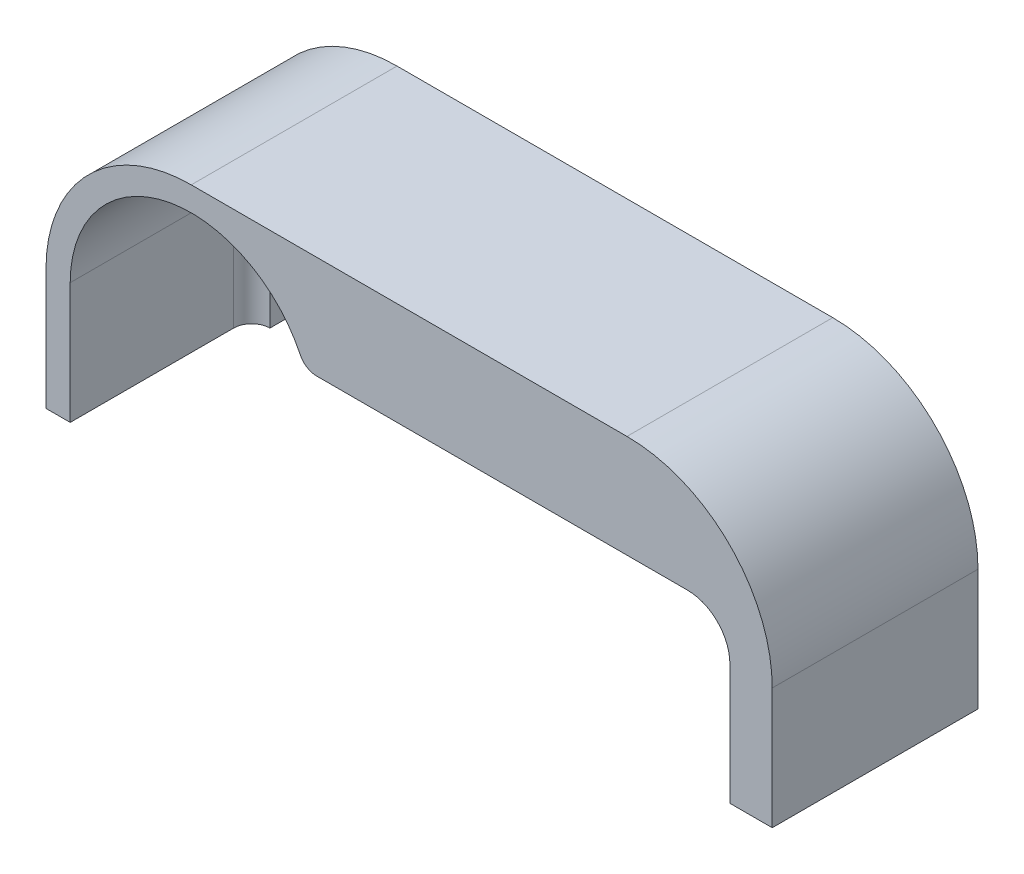
ISO-10303-21;
HEADER;
FILE_DESCRIPTION(('STEP AP214'),'2;1');
FILE_NAME('part.step','',(''),(''),'','','');
FILE_SCHEMA(('AUTOMOTIVE_DESIGN { 1 0 10303 214 1 1 1 1 }'));
ENDSEC;
DATA;
#1=APPLICATION_CONTEXT('core data for automotive mechanical design processes');
#2=APPLICATION_PROTOCOL_DEFINITION('international standard','automotive_design',2000,#1);
#3=PRODUCT_CONTEXT('',#1,'mechanical');
#4=PRODUCT('Part','Part','',(#3));
#5=PRODUCT_RELATED_PRODUCT_CATEGORY('part','',(#4));
#6=PRODUCT_DEFINITION_FORMATION('','',#4);
#7=PRODUCT_DEFINITION_CONTEXT('part definition',#1,'design');
#8=PRODUCT_DEFINITION('design','',#6,#7);
#9=PRODUCT_DEFINITION_SHAPE('','',#8);
#10=(LENGTH_UNIT() NAMED_UNIT(*) SI_UNIT(.MILLI.,.METRE.));
#11=(NAMED_UNIT(*) PLANE_ANGLE_UNIT() SI_UNIT($,.RADIAN.));
#12=(NAMED_UNIT(*) SI_UNIT($,.STERADIAN.) SOLID_ANGLE_UNIT());
#13=UNCERTAINTY_MEASURE_WITH_UNIT(LENGTH_MEASURE(1.E-05),#10,'distance_accuracy_value','');
#14=(GEOMETRIC_REPRESENTATION_CONTEXT(3) GLOBAL_UNCERTAINTY_ASSIGNED_CONTEXT((#13)) GLOBAL_UNIT_ASSIGNED_CONTEXT((#10,
#11,#12)) REPRESENTATION_CONTEXT('',''));
#15=CARTESIAN_POINT('',(0.,0.,0.));
#16=DIRECTION('',(0.,0.,1.));
#17=DIRECTION('',(1.,0.,0.));
#18=AXIS2_PLACEMENT_3D('',#15,#16,#17);
#19=CARTESIAN_POINT('',(-28.,-10.,6.5));
#20=DIRECTION('',(0.,1.,0.));
#21=DIRECTION('',(0.,0.,1.));
#22=AXIS2_PLACEMENT_3D('',#19,#20,#21);
#23=PLANE('',#22);
#24=DIRECTION('',(1.,0.,0.));
#25=VECTOR('',#24,1.);
#26=CARTESIAN_POINT('',(-28.,-10.,-8.5));
#27=LINE('',#26,#25);
#28=CARTESIAN_POINT('',(-30.,-10.,-8.5));
#29=VERTEX_POINT('',#28);
#30=CARTESIAN_POINT('',(-26.5,-10.,-8.5));
#31=VERTEX_POINT('',#30);
#32=EDGE_CURVE('E296',#29,#31,#27,.T.);
#33=ORIENTED_EDGE('',*,*,#32,.T.);
#34=DIRECTION('',(0.,0.,-1.));
#35=VECTOR('',#34,1.);
#36=CARTESIAN_POINT('',(-26.5,-10.,6.5));
#37=LINE('',#36,#35);
#38=CARTESIAN_POINT('',(-26.5,-10.,-6.5));
#39=VERTEX_POINT('',#38);
#40=EDGE_CURVE('E238',#39,#31,#37,.T.);
#41=ORIENTED_EDGE('',*,*,#40,.F.);
#42=CARTESIAN_POINT('',(-26.5,-10.,-5.));
#43=DIRECTION('',(0.,1.,0.));
#44=DIRECTION('',(0.,0.,1.));
#45=AXIS2_PLACEMENT_3D('',#42,#43,#44);
#46=CIRCLE('',#45,1.5);
#47=CARTESIAN_POINT('',(-28.,-10.,-5.));
#48=VERTEX_POINT('',#47);
#49=EDGE_CURVE('E334',#39,#48,#46,.T.);
#50=ORIENTED_EDGE('',*,*,#49,.T.);
#51=DIRECTION('',(0.,0.,-1.));
#52=VECTOR('',#51,1.);
#53=CARTESIAN_POINT('',(-28.,-10.,6.5));
#54=LINE('',#53,#52);
#55=CARTESIAN_POINT('',(-28.,-10.,8.5));
#56=VERTEX_POINT('',#55);
#57=EDGE_CURVE('E269',#56,#48,#54,.T.);
#58=ORIENTED_EDGE('',*,*,#57,.F.);
#59=DIRECTION('',(1.,0.,0.));
#60=VECTOR('',#59,1.);
#61=CARTESIAN_POINT('',(-30.,-10.,8.5));
#62=LINE('',#61,#60);
#63=CARTESIAN_POINT('',(-30.,-10.,8.5));
#64=VERTEX_POINT('',#63);
#65=EDGE_CURVE('E487',#64,#56,#62,.T.);
#66=ORIENTED_EDGE('',*,*,#65,.F.);
#67=DIRECTION('',(0.,0.,-1.));
#68=VECTOR('',#67,1.);
#69=CARTESIAN_POINT('',(-30.,-10.,6.5));
#70=LINE('',#69,#68);
#71=EDGE_CURVE('E283',#64,#29,#70,.T.);
#72=ORIENTED_EDGE('',*,*,#71,.T.);
#73=EDGE_LOOP('',(#33,#41,#50,#58,#66,#72));
#74=FACE_BOUND('',#73,.T.);
#75=ADVANCED_FACE('F47',(#74),#23,.F.);
#76=CARTESIAN_POINT('',(-18.,0.,6.5));
#77=DIRECTION('',(0.,0.,-1.));
#78=DIRECTION('',(-1.,0.,0.));
#79=AXIS2_PLACEMENT_3D('',#76,#77,#78);
#80=CYLINDRICAL_SURFACE('',#79,12.);
#81=CARTESIAN_POINT('',(-18.,0.,-8.5));
#82=DIRECTION('',(0.,0.,1.));
#83=DIRECTION('',(1.,0.,0.));
#84=AXIS2_PLACEMENT_3D('',#81,#82,#83);
#85=CIRCLE('',#84,12.);
#86=CARTESIAN_POINT('',(-18.,12.,-8.5));
#87=VERTEX_POINT('',#86);
#88=CARTESIAN_POINT('',(-30.,0.,-8.5));
#89=VERTEX_POINT('',#88);
#90=EDGE_CURVE('E275',#87,#89,#85,.T.);
#91=ORIENTED_EDGE('',*,*,#90,.T.);
#92=DIRECTION('',(0.,0.,-1.));
#93=VECTOR('',#92,1.);
#94=CARTESIAN_POINT('',(-30.,0.,6.5));
#95=LINE('',#94,#93);
#96=CARTESIAN_POINT('',(-30.,0.,8.5));
#97=VERTEX_POINT('',#96);
#98=EDGE_CURVE('E279',#97,#89,#95,.T.);
#99=ORIENTED_EDGE('',*,*,#98,.F.);
#100=CARTESIAN_POINT('',(-18.,0.,8.5));
#101=DIRECTION('',(0.,0.,1.));
#102=DIRECTION('',(1.,0.,0.));
#103=AXIS2_PLACEMENT_3D('',#100,#101,#102);
#104=CIRCLE('',#103,12.);
#105=CARTESIAN_POINT('',(-18.,12.,8.5));
#106=VERTEX_POINT('',#105);
#107=EDGE_CURVE('E481',#106,#97,#104,.T.);
#108=ORIENTED_EDGE('',*,*,#107,.F.);
#109=DIRECTION('',(0.,0.,-1.));
#110=VECTOR('',#109,1.);
#111=CARTESIAN_POINT('',(-18.,12.,6.5));
#112=LINE('',#111,#110);
#113=EDGE_CURVE('E284',#106,#87,#112,.T.);
#114=ORIENTED_EDGE('',*,*,#113,.T.);
#115=EDGE_LOOP('',(#91,#99,#108,#114));
#116=FACE_BOUND('',#115,.T.);
#117=ADVANCED_FACE('F424',(#116),#80,.T.);
#118=CARTESIAN_POINT('',(-30.,0.,6.5));
#119=DIRECTION('',(1.,0.,0.));
#120=DIRECTION('',(0.,0.,-1.));
#121=AXIS2_PLACEMENT_3D('',#118,#119,#120);
#122=PLANE('',#121);
#123=DIRECTION('',(0.,-1.,0.));
#124=VECTOR('',#123,1.);
#125=CARTESIAN_POINT('',(-30.,0.,-8.5));
#126=LINE('',#125,#124);
#127=EDGE_CURVE('E278',#89,#29,#126,.T.);
#128=ORIENTED_EDGE('',*,*,#127,.T.);
#129=ORIENTED_EDGE('',*,*,#71,.F.);
#130=DIRECTION('',(0.,-1.,0.));
#131=VECTOR('',#130,1.);
#132=CARTESIAN_POINT('',(-30.,0.,8.5));
#133=LINE('',#132,#131);
#134=EDGE_CURVE('E484',#97,#64,#133,.T.);
#135=ORIENTED_EDGE('',*,*,#134,.F.);
#136=ORIENTED_EDGE('',*,*,#98,.T.);
#137=EDGE_LOOP('',(#128,#129,#135,#136));
#138=FACE_BOUND('',#137,.T.);
#139=ADVANCED_FACE('F431',(#138),#122,.F.);
#140=CARTESIAN_POINT('',(26.5,-10.,-5.));
#141=DIRECTION('',(0.,1.,0.));
#142=DIRECTION('',(0.,0.,1.));
#143=AXIS2_PLACEMENT_3D('',#140,#141,#142);
#144=CIRCLE('',#143,1.5);
#145=CARTESIAN_POINT('',(28.,-10.,-5.));
#146=VERTEX_POINT('',#145);
#147=CARTESIAN_POINT('',(26.5,-10.,-6.5));
#148=VERTEX_POINT('',#147);
#149=EDGE_CURVE('E331',#146,#148,#144,.T.);
#150=ORIENTED_EDGE('',*,*,#149,.T.);
#151=DIRECTION('',(0.,0.,-1.));
#152=VECTOR('',#151,1.);
#153=CARTESIAN_POINT('',(26.5,-10.,6.5));
#154=LINE('',#153,#152);
#155=CARTESIAN_POINT('',(26.5,-10.,-8.5));
#156=VERTEX_POINT('',#155);
#157=EDGE_CURVE('E241',#148,#156,#154,.T.);
#158=ORIENTED_EDGE('',*,*,#157,.T.);
#159=CARTESIAN_POINT('',(30.,-10.,-8.5));
#160=VERTEX_POINT('',#159);
#161=EDGE_CURVE('E290',#156,#160,#27,.T.);
#162=ORIENTED_EDGE('',*,*,#161,.T.);
#163=DIRECTION('',(0.,0.,-1.));
#164=VECTOR('',#163,1.);
#165=CARTESIAN_POINT('',(30.,-10.,6.5));
#166=LINE('',#165,#164);
#167=CARTESIAN_POINT('',(30.,-10.,8.5));
#168=VERTEX_POINT('',#167);
#169=EDGE_CURVE('E300',#168,#160,#166,.T.);
#170=ORIENTED_EDGE('',*,*,#169,.F.);
#171=DIRECTION('',(1.,0.,0.));
#172=VECTOR('',#171,1.);
#173=CARTESIAN_POINT('',(26.5,-10.,8.5));
#174=LINE('',#173,#172);
#175=CARTESIAN_POINT('',(26.5,-10.,8.5));
#176=VERTEX_POINT('',#175);
#177=EDGE_CURVE('E225',#176,#168,#174,.T.);
#178=ORIENTED_EDGE('',*,*,#177,.F.);
#179=DIRECTION('',(0.,0.,-1.));
#180=VECTOR('',#179,1.);
#181=CARTESIAN_POINT('',(26.5,-10.,8.5));
#182=LINE('',#181,#180);
#183=CARTESIAN_POINT('',(26.5,-10.,6.5));
#184=VERTEX_POINT('',#183);
#185=EDGE_CURVE('E223',#176,#184,#182,.T.);
#186=ORIENTED_EDGE('',*,*,#185,.T.);
#187=CARTESIAN_POINT('',(26.5,-10.,5.));
#188=DIRECTION('',(0.,1.,0.));
#189=DIRECTION('',(0.,0.,1.));
#190=AXIS2_PLACEMENT_3D('',#187,#188,#189);
#191=CIRCLE('',#190,1.5);
#192=CARTESIAN_POINT('',(28.,-10.,5.));
#193=VERTEX_POINT('',#192);
#194=EDGE_CURVE('E513',#184,#193,#191,.T.);
#195=ORIENTED_EDGE('',*,*,#194,.T.);
#196=DIRECTION('',(0.,0.,-1.));
#197=VECTOR('',#196,1.);
#198=CARTESIAN_POINT('',(28.,-10.,6.5));
#199=LINE('',#198,#197);
#200=EDGE_CURVE('E267',#193,#146,#199,.T.);
#201=ORIENTED_EDGE('',*,*,#200,.T.);
#202=EDGE_LOOP('',(#150,#158,#162,#170,#178,#186,#195,#201));
#203=FACE_BOUND('',#202,.T.);
#204=ADVANCED_FACE('F427',(#203),#23,.F.);
#205=CARTESIAN_POINT('',(30.,0.,6.5));
#206=DIRECTION('',(-1.,0.,0.));
#207=DIRECTION('',(0.,0.,1.));
#208=AXIS2_PLACEMENT_3D('',#205,#206,#207);
#209=PLANE('',#208);
#210=DIRECTION('',(0.,1.,0.));
#211=VECTOR('',#210,1.);
#212=CARTESIAN_POINT('',(30.,0.,-8.5));
#213=LINE('',#212,#211);
#214=CARTESIAN_POINT('',(30.,0.,-8.5));
#215=VERTEX_POINT('',#214);
#216=EDGE_CURVE('E294',#160,#215,#213,.T.);
#217=ORIENTED_EDGE('',*,*,#216,.T.);
#218=DIRECTION('',(0.,0.,-1.));
#219=VECTOR('',#218,1.);
#220=CARTESIAN_POINT('',(30.,0.,6.5));
#221=LINE('',#220,#219);
#222=CARTESIAN_POINT('',(30.,0.,8.5));
#223=VERTEX_POINT('',#222);
#224=EDGE_CURVE('E297',#223,#215,#221,.T.);
#225=ORIENTED_EDGE('',*,*,#224,.F.);
#226=DIRECTION('',(0.,1.,0.));
#227=VECTOR('',#226,1.);
#228=CARTESIAN_POINT('',(30.,-10.,8.5));
#229=LINE('',#228,#227);
#230=EDGE_CURVE('E470',#168,#223,#229,.T.);
#231=ORIENTED_EDGE('',*,*,#230,.F.);
#232=ORIENTED_EDGE('',*,*,#169,.T.);
#233=EDGE_LOOP('',(#217,#225,#231,#232));
#234=FACE_BOUND('',#233,.T.);
#235=ADVANCED_FACE('F435',(#234),#209,.F.);
#236=CARTESIAN_POINT('',(18.,0.,6.5));
#237=DIRECTION('',(0.,0.,-1.));
#238=DIRECTION('',(-1.,0.,0.));
#239=AXIS2_PLACEMENT_3D('',#236,#237,#238);
#240=CYLINDRICAL_SURFACE('',#239,12.);
#241=CARTESIAN_POINT('',(18.,0.,-8.5));
#242=DIRECTION('',(0.,0.,1.));
#243=DIRECTION('',(1.,0.,0.));
#244=AXIS2_PLACEMENT_3D('',#241,#242,#243);
#245=CIRCLE('',#244,12.);
#246=CARTESIAN_POINT('',(18.,12.,-8.5));
#247=VERTEX_POINT('',#246);
#248=EDGE_CURVE('E292',#215,#247,#245,.T.);
#249=ORIENTED_EDGE('',*,*,#248,.T.);
#250=DIRECTION('',(0.,0.,-1.));
#251=VECTOR('',#250,1.);
#252=CARTESIAN_POINT('',(18.,12.,6.5));
#253=LINE('',#252,#251);
#254=CARTESIAN_POINT('',(18.,12.,8.5));
#255=VERTEX_POINT('',#254);
#256=EDGE_CURVE('E287',#255,#247,#253,.T.);
#257=ORIENTED_EDGE('',*,*,#256,.F.);
#258=CARTESIAN_POINT('',(18.,0.,8.5));
#259=DIRECTION('',(0.,0.,1.));
#260=DIRECTION('',(1.,0.,0.));
#261=AXIS2_PLACEMENT_3D('',#258,#259,#260);
#262=CIRCLE('',#261,12.);
#263=EDGE_CURVE('E473',#223,#255,#262,.T.);
#264=ORIENTED_EDGE('',*,*,#263,.F.);
#265=ORIENTED_EDGE('',*,*,#224,.T.);
#266=EDGE_LOOP('',(#249,#257,#264,#265));
#267=FACE_BOUND('',#266,.T.);
#268=ADVANCED_FACE('F441',(#267),#240,.T.);
#269=CARTESIAN_POINT('',(-18.,12.,6.5));
#270=DIRECTION('',(0.,-1.,0.));
#271=DIRECTION('',(0.,0.,-1.));
#272=AXIS2_PLACEMENT_3D('',#269,#270,#271);
#273=PLANE('',#272);
#274=DIRECTION('',(-1.,0.,0.));
#275=VECTOR('',#274,1.);
#276=CARTESIAN_POINT('',(-18.,12.,-8.5));
#277=LINE('',#276,#275);
#278=EDGE_CURVE('E288',#247,#87,#277,.T.);
#279=ORIENTED_EDGE('',*,*,#278,.T.);
#280=ORIENTED_EDGE('',*,*,#113,.F.);
#281=DIRECTION('',(-1.,0.,0.));
#282=VECTOR('',#281,1.);
#283=CARTESIAN_POINT('',(18.,12.,8.5));
#284=LINE('',#283,#282);
#285=EDGE_CURVE('E475',#255,#106,#284,.T.);
#286=ORIENTED_EDGE('',*,*,#285,.F.);
#287=ORIENTED_EDGE('',*,*,#256,.T.);
#288=EDGE_LOOP('',(#279,#280,#286,#287));
#289=FACE_BOUND('',#288,.T.);
#290=ADVANCED_FACE('F615',(#289),#273,.F.);
#291=CARTESIAN_POINT('',(-18.,0.,-8.5));
#292=DIRECTION('',(0.,0.,1.));
#293=DIRECTION('',(1.,0.,0.));
#294=AXIS2_PLACEMENT_3D('',#291,#292,#293);
#295=PLANE('',#294);
#296=CARTESIAN_POINT('',(-18.,0.,-8.5));
#297=DIRECTION('',(0.,0.,-1.));
#298=DIRECTION('',(-1.,0.,0.));
#299=AXIS2_PLACEMENT_3D('',#296,#297,#298);
#300=CIRCLE('',#299,8.5);
#301=CARTESIAN_POINT('',(-26.5,0.,-8.5));
#302=VERTEX_POINT('',#301);
#303=CARTESIAN_POINT('',(-18.,8.5,-8.5));
#304=VERTEX_POINT('',#303);
#305=EDGE_CURVE('E258',#302,#304,#300,.T.);
#306=ORIENTED_EDGE('',*,*,#305,.F.);
#307=DIRECTION('',(0.,-1.,0.));
#308=VECTOR('',#307,1.);
#309=CARTESIAN_POINT('',(-26.5,0.,-8.5));
#310=LINE('',#309,#308);
#311=EDGE_CURVE('E254',#302,#31,#310,.T.);
#312=ORIENTED_EDGE('',*,*,#311,.T.);
#313=ORIENTED_EDGE('',*,*,#32,.F.);
#314=ORIENTED_EDGE('',*,*,#127,.F.);
#315=ORIENTED_EDGE('',*,*,#90,.F.);
#316=ORIENTED_EDGE('',*,*,#278,.F.);
#317=ORIENTED_EDGE('',*,*,#248,.F.);
#318=ORIENTED_EDGE('',*,*,#216,.F.);
#319=ORIENTED_EDGE('',*,*,#161,.F.);
#320=DIRECTION('',(0.,1.,0.));
#321=VECTOR('',#320,1.);
#322=CARTESIAN_POINT('',(26.5,0.,-8.5));
#323=LINE('',#322,#321);
#324=CARTESIAN_POINT('',(26.5,0.,-8.5));
#325=VERTEX_POINT('',#324);
#326=EDGE_CURVE('E240',#156,#325,#323,.T.);
#327=ORIENTED_EDGE('',*,*,#326,.T.);
#328=CARTESIAN_POINT('',(18.,0.,-8.5));
#329=DIRECTION('',(0.,0.,-1.));
#330=DIRECTION('',(-1.,0.,0.));
#331=AXIS2_PLACEMENT_3D('',#328,#329,#330);
#332=CIRCLE('',#331,8.5);
#333=CARTESIAN_POINT('',(18.,8.5,-8.5));
#334=VERTEX_POINT('',#333);
#335=EDGE_CURVE('E348',#334,#325,#332,.T.);
#336=ORIENTED_EDGE('',*,*,#335,.F.);
#337=DIRECTION('',(-1.,0.,0.));
#338=VECTOR('',#337,1.);
#339=CARTESIAN_POINT('',(-18.,8.5,-8.5));
#340=LINE('',#339,#338);
#341=EDGE_CURVE('E253',#304,#334,#340,.F.);
#342=ORIENTED_EDGE('',*,*,#341,.F.);
#343=EDGE_LOOP('',(#306,#312,#313,#314,#315,#316,#317,#318,#319,#327,#336,#342));
#344=FACE_BOUND('',#343,.T.);
#345=ADVANCED_FACE('F465',(#344),#295,.F.);
#346=CARTESIAN_POINT('',(-18.,0.,6.5));
#347=DIRECTION('',(0.,0.,-1.));
#348=DIRECTION('',(-1.,0.,0.));
#349=AXIS2_PLACEMENT_3D('',#346,#347,#348);
#350=CYLINDRICAL_SURFACE('',#349,10.);
#351=CARTESIAN_POINT('',(-18.,0.,6.5));
#352=DIRECTION('',(0.,0.,-1.));
#353=DIRECTION('',(-1.,0.,0.));
#354=AXIS2_PLACEMENT_3D('',#351,#352,#353);
#355=CIRCLE('',#354,10.);
#356=CARTESIAN_POINT('',(-12.7321731235736,8.5,6.5));
#357=VERTEX_POINT('',#356);
#358=CARTESIAN_POINT('',(-8.99464557512697,4.34782608695652,6.5));
#359=VERTEX_POINT('',#358);
#360=EDGE_CURVE('E496',#357,#359,#355,.T.);
#361=ORIENTED_EDGE('',*,*,#360,.T.);
#362=DIRECTION('',(0.,0.,-1.));
#363=VECTOR('',#362,1.);
#364=CARTESIAN_POINT('',(-8.99464557512697,4.34782608695652,6.5));
#365=LINE('',#364,#363);
#366=CARTESIAN_POINT('',(-8.99464557512697,4.34782608695652,8.5));
#367=VERTEX_POINT('',#366);
#368=EDGE_CURVE('E63',#359,#367,#365,.F.);
#369=ORIENTED_EDGE('',*,*,#368,.T.);
#370=CARTESIAN_POINT('',(-18.,0.,8.5));
#371=DIRECTION('',(0.,0.,-1.));
#372=DIRECTION('',(-1.,0.,0.));
#373=AXIS2_PLACEMENT_3D('',#370,#371,#372);
#374=CIRCLE('',#373,10.);
#375=CARTESIAN_POINT('',(-28.,0.,8.5));
#376=VERTEX_POINT('',#375);
#377=EDGE_CURVE('E499',#376,#367,#374,.T.);
#378=ORIENTED_EDGE('',*,*,#377,.F.);
#379=DIRECTION('',(0.,0.,-1.));
#380=VECTOR('',#379,1.);
#381=CARTESIAN_POINT('',(-28.,0.,6.5));
#382=LINE('',#381,#380);
#383=CARTESIAN_POINT('',(-28.,0.,-5.));
#384=VERTEX_POINT('',#383);
#385=EDGE_CURVE('E272',#376,#384,#382,.T.);
#386=ORIENTED_EDGE('',*,*,#385,.T.);
#387=CARTESIAN_POINT('',(-18.,0.,-5.));
#388=DIRECTION('',(0.,0.,1.));
#389=DIRECTION('',(1.,0.,0.));
#390=AXIS2_PLACEMENT_3D('',#387,#388,#389);
#391=CIRCLE('',#390,10.);
#392=CARTESIAN_POINT('',(-18.,10.,-5.));
#393=VERTEX_POINT('',#392);
#394=EDGE_CURVE('E329',#384,#393,#391,.F.);
#395=ORIENTED_EDGE('',*,*,#394,.T.);
#396=DIRECTION('',(0.,0.,-1.));
#397=VECTOR('',#396,1.);
#398=CARTESIAN_POINT('',(-18.,10.,6.5));
#399=LINE('',#398,#397);
#400=CARTESIAN_POINT('',(-18.,10.,6.5));
#401=VERTEX_POINT('',#400);
#402=EDGE_CURVE('E259',#401,#393,#399,.T.);
#403=ORIENTED_EDGE('',*,*,#402,.F.);
#404=EDGE_CURVE('E492',#401,#357,#355,.T.);
#405=ORIENTED_EDGE('',*,*,#404,.T.);
#406=EDGE_LOOP('',(#361,#369,#378,#386,#395,#403,#405));
#407=FACE_BOUND('',#406,.T.);
#408=ADVANCED_FACE('F527',(#407),#350,.F.);
#409=CARTESIAN_POINT('',(-28.,0.,6.5));
#410=DIRECTION('',(1.,0.,0.));
#411=DIRECTION('',(0.,0.,-1.));
#412=AXIS2_PLACEMENT_3D('',#409,#410,#411);
#413=PLANE('',#412);
#414=ORIENTED_EDGE('',*,*,#57,.T.);
#415=DIRECTION('',(0.,-1.,0.));
#416=VECTOR('',#415,1.);
#417=CARTESIAN_POINT('',(-28.,0.,-5.));
#418=LINE('',#417,#416);
#419=EDGE_CURVE('E327',#48,#384,#418,.F.);
#420=ORIENTED_EDGE('',*,*,#419,.T.);
#421=ORIENTED_EDGE('',*,*,#385,.F.);
#422=DIRECTION('',(0.,1.,0.));
#423=VECTOR('',#422,1.);
#424=CARTESIAN_POINT('',(-28.,-10.,8.5));
#425=LINE('',#424,#423);
#426=EDGE_CURVE('E234',#56,#376,#425,.T.);
#427=ORIENTED_EDGE('',*,*,#426,.F.);
#428=EDGE_LOOP('',(#414,#420,#421,#427));
#429=FACE_BOUND('',#428,.T.);
#430=ADVANCED_FACE('F604',(#429),#413,.T.);
#431=CARTESIAN_POINT('',(28.,0.,6.5));
#432=DIRECTION('',(-1.,0.,0.));
#433=DIRECTION('',(0.,0.,1.));
#434=AXIS2_PLACEMENT_3D('',#431,#432,#433);
#435=PLANE('',#434);
#436=ORIENTED_EDGE('',*,*,#200,.F.);
#437=DIRECTION('',(0.,1.,0.));
#438=VECTOR('',#437,1.);
#439=CARTESIAN_POINT('',(28.,0.,5.));
#440=LINE('',#439,#438);
#441=CARTESIAN_POINT('',(28.,0.,5.));
#442=VERTEX_POINT('',#441);
#443=EDGE_CURVE('E336',#193,#442,#440,.T.);
#444=ORIENTED_EDGE('',*,*,#443,.T.);
#445=DIRECTION('',(0.,0.,-1.));
#446=VECTOR('',#445,1.);
#447=CARTESIAN_POINT('',(28.,0.,6.5));
#448=LINE('',#447,#446);
#449=CARTESIAN_POINT('',(28.,0.,-5.));
#450=VERTEX_POINT('',#449);
#451=EDGE_CURVE('E265',#442,#450,#448,.T.);
#452=ORIENTED_EDGE('',*,*,#451,.T.);
#453=DIRECTION('',(0.,1.,0.));
#454=VECTOR('',#453,1.);
#455=CARTESIAN_POINT('',(28.,-10.,-5.));
#456=LINE('',#455,#454);
#457=EDGE_CURVE('E318',#450,#146,#456,.F.);
#458=ORIENTED_EDGE('',*,*,#457,.T.);
#459=EDGE_LOOP('',(#436,#444,#452,#458));
#460=FACE_BOUND('',#459,.T.);
#461=ADVANCED_FACE('F579',(#460),#435,.T.);
#462=CARTESIAN_POINT('',(18.,0.,6.5));
#463=DIRECTION('',(0.,0.,-1.));
#464=DIRECTION('',(-1.,0.,0.));
#465=AXIS2_PLACEMENT_3D('',#462,#463,#464);
#466=CYLINDRICAL_SURFACE('',#465,10.);
#467=ORIENTED_EDGE('',*,*,#451,.F.);
#468=CARTESIAN_POINT('',(18.,0.,5.));
#469=DIRECTION('',(0.,0.,-1.));
#470=DIRECTION('',(-1.,0.,0.));
#471=AXIS2_PLACEMENT_3D('',#468,#469,#470);
#472=CIRCLE('',#471,10.);
#473=CARTESIAN_POINT('',(18.,10.,5.));
#474=VERTEX_POINT('',#473);
#475=EDGE_CURVE('E359',#442,#474,#472,.F.);
#476=ORIENTED_EDGE('',*,*,#475,.T.);
#477=DIRECTION('',(0.,0.,-1.));
#478=VECTOR('',#477,1.);
#479=CARTESIAN_POINT('',(18.,10.,6.5));
#480=LINE('',#479,#478);
#481=CARTESIAN_POINT('',(18.,10.,-5.));
#482=VERTEX_POINT('',#481);
#483=EDGE_CURVE('E262',#474,#482,#480,.T.);
#484=ORIENTED_EDGE('',*,*,#483,.T.);
#485=CARTESIAN_POINT('',(18.,0.,-5.));
#486=DIRECTION('',(0.,0.,1.));
#487=DIRECTION('',(1.,0.,0.));
#488=AXIS2_PLACEMENT_3D('',#485,#486,#487);
#489=CIRCLE('',#488,10.);
#490=EDGE_CURVE('E321',#482,#450,#489,.F.);
#491=ORIENTED_EDGE('',*,*,#490,.T.);
#492=EDGE_LOOP('',(#467,#476,#484,#491));
#493=FACE_BOUND('',#492,.T.);
#494=ADVANCED_FACE('F381',(#493),#466,.F.);
#495=CARTESIAN_POINT('',(-18.,10.,6.5));
#496=DIRECTION('',(0.,-1.,0.));
#497=DIRECTION('',(0.,0.,-1.));
#498=AXIS2_PLACEMENT_3D('',#495,#496,#497);
#499=PLANE('',#498);
#500=ORIENTED_EDGE('',*,*,#483,.F.);
#501=DIRECTION('',(-1.,0.,0.));
#502=VECTOR('',#501,1.);
#503=CARTESIAN_POINT('',(-18.,10.,5.));
#504=LINE('',#503,#502);
#505=CARTESIAN_POINT('',(-12.7321731235736,10.,5.));
#506=VERTEX_POINT('',#505);
#507=EDGE_CURVE('E369',#474,#506,#504,.T.);
#508=ORIENTED_EDGE('',*,*,#507,.T.);
#509=CARTESIAN_POINT('',(-11.6702571430378,10.,5.12431596994679));
#510=CARTESIAN_POINT('',(-12.1951842504862,10.,7.14648631243843));
#511=CARTESIAN_POINT('',(-12.0273654555695,8.02045114682931,6.5));
#512=CARTESIAN_POINT('',(-11.7808941012655,10.,5.09566697467884));
#513=CARTESIAN_POINT('',(-12.2157134374133,10.,7.06259806516419));
#514=CARTESIAN_POINT('',(-12.0944943821047,8.07045148311202,6.5));
#515=CARTESIAN_POINT('',(-11.8928335314834,10.,5.07267255791449));
#516=CARTESIAN_POINT('',(-12.2520999866187,10.,6.98129766805207));
#517=CARTESIAN_POINT('',(-12.1643481755933,8.121149231176,6.5));
#518=CARTESIAN_POINT('',(-12.1180553673549,10.,5.03661905527257));
#519=CARTESIAN_POINT('',(-12.3484742346289,10.,6.83053079936916));
#520=CARTESIAN_POINT('',(-12.3089762340618,8.22313876514533,6.5));
#521=CARTESIAN_POINT('',(-12.231334020047,10.,5.02353685998374));
#522=CARTESIAN_POINT('',(-12.4075200634051,10.,6.76039959163697));
#523=CARTESIAN_POINT('',(-12.3837386097776,8.2744288845311,6.5));
#524=CARTESIAN_POINT('',(-12.4571648424413,10.,5.00591735527782));
#525=CARTESIAN_POINT('',(-12.541306112635,10.,6.6332803944877));
#526=CARTESIAN_POINT('',(-12.5370660189874,8.37643988502303,6.5));
#527=CARTESIAN_POINT('',(-12.569709913791,10.,5.00128147092185));
#528=CARTESIAN_POINT('',(-12.6153676974139,10.,6.57559351737699));
#529=CARTESIAN_POINT('',(-12.6155760637538,8.42716037508199,6.5));
#530=CARTESIAN_POINT('',(-12.7949291759459,10.,4.9991815008487));
#531=CARTESIAN_POINT('',(-12.7749197760678,10.,6.47153302639203));
#532=CARTESIAN_POINT('',(-12.7770151925555,8.52815972682942,6.5));
#533=CARTESIAN_POINT('',(-12.9076034003611,10.,5.00172278256131));
#534=CARTESIAN_POINT('',(-12.8602045966001,10.,6.42468618529318));
#535=CARTESIAN_POINT('',(-12.8599475383037,8.5784382297777,6.5));
#536=CARTESIAN_POINT('',(-13.2413401900141,10.,5.01851231670565));
#537=CARTESIAN_POINT('',(-13.1213581813688,10.,6.30300821410641));
#538=CARTESIAN_POINT('',(-13.1121630016973,8.72619816530361,6.5));
#539=CARTESIAN_POINT('',(-13.4619632888503,10.,5.04169808902432));
#540=CARTESIAN_POINT('',(-13.3123523286986,10.,6.23918228341616));
#541=CARTESIAN_POINT('',(-13.2874721658111,8.82235995259231,6.5));
#542=CARTESIAN_POINT('',(-13.9004297762,10.,5.10657696541647));
#543=CARTESIAN_POINT('',(-13.7099373931497,10.,6.14485037163499));
#544=CARTESIAN_POINT('',(-13.6529790785566,9.00807964994687,6.5));
#545=CARTESIAN_POINT('',(-14.1182710794371,10.,5.14828320079038));
#546=CARTESIAN_POINT('',(-13.9171574877824,10.,6.11250422164878));
#547=CARTESIAN_POINT('',(-13.8431873119152,9.09763282176941,6.5));
#548=CARTESIAN_POINT('',(-14.5524429049423,10.,5.24637453541678));
#549=CARTESIAN_POINT('',(-14.3406517555315,10.,6.07320048844342));
#550=CARTESIAN_POINT('',(-14.2386770278741,9.26818135743371,6.5));
#551=CARTESIAN_POINT('',(-14.7687462897024,10.,5.30287747608263));
#552=CARTESIAN_POINT('',(-14.5581195594691,10.,6.06534499086357));
#553=CARTESIAN_POINT('',(-14.4440695598136,9.34910032572004,6.5));
#554=CARTESIAN_POINT('',(-15.1980430342863,10.,5.42691577409739));
#555=CARTESIAN_POINT('',(-14.9960195170895,10.,6.06915587425513));
#556=CARTESIAN_POINT('',(-14.8667954792326,9.49912169864598,6.5));
#557=CARTESIAN_POINT('',(-15.411037264051,10.,5.49444817627675));
#558=CARTESIAN_POINT('',(-15.2176951721399,10.,6.08024210257319));
#559=CARTESIAN_POINT('',(-15.0841256578851,9.56822725837818,6.5));
#560=CARTESIAN_POINT('',(-15.8231022507176,10.,5.63394937130577));
#561=CARTESIAN_POINT('',(-15.6503245202607,10.,6.11569487895939));
#562=CARTESIAN_POINT('',(-15.5171170891549,9.68933143376138,6.5));
#563=CARTESIAN_POINT('',(-16.0223167663671,10.,5.70549890145171));
#564=CARTESIAN_POINT('',(-15.8621193068988,10.,6.13911872700174));
#565=CARTESIAN_POINT('',(-15.7322665477075,9.74203787632846,6.5));
#566=CARTESIAN_POINT('',(-16.4187563512432,10.,5.85388152384914));
#567=CARTESIAN_POINT('',(-16.2853566785114,10.,6.19493701880634));
#568=CARTESIAN_POINT('',(-16.1696017877091,9.83359281234551,6.5));
#569=CARTESIAN_POINT('',(-16.6159813624455,10.,5.93071476969323));
#570=CARTESIAN_POINT('',(-16.4979238161537,10.,6.22733416124144));
#571=CARTESIAN_POINT('',(-16.391787773602,9.87244090274303,6.5));
#572=CARTESIAN_POINT('',(-17.0085262077801,10.,6.08759134537312));
#573=CARTESIAN_POINT('',(-16.9216407478545,10.,6.29770435378955));
#574=CARTESIAN_POINT('',(-16.8404064638421,9.93511451528596,6.5));
#575=CARTESIAN_POINT('',(-17.2038497289348,10.,6.16762553016682));
#576=CARTESIAN_POINT('',(-17.1339041174999,10.,6.33578499330848));
#577=CARTESIAN_POINT('',(-17.0668262059127,9.95897997868202,6.5));
#578=CARTESIAN_POINT('',(-17.5937855615565,10.,6.32938494881379));
#579=CARTESIAN_POINT('',(-17.5573827680876,10.,6.41461336648542));
#580=CARTESIAN_POINT('',(-17.5221518914059,9.99118335875357,6.5));
#581=CARTESIAN_POINT('',(-17.7883978864734,10.,6.41111015049055));
#582=CARTESIAN_POINT('',(-17.7697112816619,10.,6.45555284113754));
#583=CARTESIAN_POINT('',(-17.751057787483,9.999521570606,6.5));
#584=CARTESIAN_POINT('',(-17.988666666942,10.,6.49523904796599));
#585=CARTESIAN_POINT('',(-17.9876666537754,10.,6.49761952003636));
#586=CARTESIAN_POINT('',(-17.9866666659176,9.99999334918036,6.5));
#587=CARTESIAN_POINT('',(-17.9943333335629,10.,6.49761952429107));
#588=CARTESIAN_POINT('',(-17.9938333341211,10.,6.4988097607731));
#589=CARTESIAN_POINT('',(-17.9933333324733,10.0000000167921,6.5));
#590=CARTESIAN_POINT('',(-18.,10.,6.5));
#591=CARTESIAN_POINT('',(-18.,10.,6.5));
#592=CARTESIAN_POINT('',(-18.,10.,6.5));
#593=(BOUNDED_SURFACE() B_SPLINE_SURFACE(3,2,((#509,#510,#511),(#512,#513,#514),(#515,#516,
#517),(#518,#519,#520),(#521,#522,#523),(#524,#525,#526),(#527,#528,#529),(#530,#531,#532),
(#533,#534,#535),(#536,#537,#538),(#539,#540,#541),(#542,#543,#544),(#545,#546,#547),(#548,#549,
#550),(#551,#552,#553),(#554,#555,#556),(#557,#558,#559),(#560,#561,#562),(#563,#564,#565),
(#566,#567,#568),(#569,#570,#571),(#572,#573,#574),(#575,#576,#577),(#578,#579,#580),(#581,#582,
#583),(#584,#585,#586),(#587,#588,#589),(#590,#591,#592)),.UNSPECIFIED.,.F.,.F.,
.F.) B_SPLINE_SURFACE_WITH_KNOTS((4,2,2,2,2,2,2,2,2,2,2,2,2,4),(3,3),(0.,0.342484740610274,
0.684168532325737,1.02183842338976,1.35976090708367,2.02411643297197,2.68894375135697,
3.35923591114436,4.02934877050833,4.66426814888345,5.29920599157097,5.93244392420353,
6.56566981870184,6.58410890765098),(0.,1.),
.UNSPECIFIED.) GEOMETRIC_REPRESENTATION_ITEM() RATIONAL_B_SPLINE_SURFACE(((1.,0.583224126967014,
1.),(1.,0.597513576090503,1.),(1.,0.611475290809382,1.),(1.,0.63866816776859,1.),(1.,
0.65190096214898,1.),(1.,0.677477036640369,1.),(1.,0.689828940094637,1.),(1.,0.713813963624852,
1.),(1.,0.725446539105937,1.),(1.,0.758874947806273,1.),(1.,0.779633483202118,1.),(1.,
0.81837352601845,1.),(1.,0.836353050861945,1.),(1.,0.869678250995014,1.),(1.,0.885001061366056,
1.),(1.,0.912816508903206,1.),(1.,0.925309902032712,1.),(1.,0.946865165181702,1.),(1.,
0.956072794962295,1.),(1.,0.971902081877147,1.),(1.,0.978523663800045,1.),(1.,0.98914084323305,
1.),(1.,0.993143423791309,1.),(1.,0.998533145906897,1.),(1.,0.999920337183437,1.),(1.,
0.999998889327861,1.),(1.,1.0000000004652,1.),(1.,1.,1.))) REPRESENTATION_ITEM('') SURFACE());
#594=CARTESIAN_POINT('',(-11.6702571430378,10.,5.12431596994679));
#595=CARTESIAN_POINT('',(-11.7808941012655,10.,5.09566697467884));
#596=CARTESIAN_POINT('',(-11.8928335314834,10.,5.07267255791449));
#597=CARTESIAN_POINT('',(-12.1180553673549,10.,5.03661905527257));
#598=CARTESIAN_POINT('',(-12.231334020047,10.,5.02353685998374));
#599=CARTESIAN_POINT('',(-12.4571648424413,10.,5.00591735527782));
#600=CARTESIAN_POINT('',(-12.569709913791,10.,5.00128147092185));
#601=CARTESIAN_POINT('',(-12.7949291759459,10.,4.9991815008487));
#602=CARTESIAN_POINT('',(-12.9076034003611,10.,5.00172278256131));
#603=CARTESIAN_POINT('',(-13.2413401900141,10.,5.01851231670565));
#604=CARTESIAN_POINT('',(-13.4619632888503,10.,5.04169808902432));
#605=CARTESIAN_POINT('',(-13.9004297762,10.,5.10657696541647));
#606=CARTESIAN_POINT('',(-14.1182710794371,10.,5.14828320079038));
#607=CARTESIAN_POINT('',(-14.5524429049423,10.,5.24637453541678));
#608=CARTESIAN_POINT('',(-14.7687462897024,10.,5.30287747608263));
#609=CARTESIAN_POINT('',(-15.1980430342863,10.,5.42691577409739));
#610=CARTESIAN_POINT('',(-15.411037264051,10.,5.49444817627675));
#611=CARTESIAN_POINT('',(-15.8231022507176,10.,5.63394937130577));
#612=CARTESIAN_POINT('',(-16.0223167663671,10.,5.70549890145171));
#613=CARTESIAN_POINT('',(-16.4187563512432,10.,5.85388152384914));
#614=CARTESIAN_POINT('',(-16.6159813624455,10.,5.93071476969323));
#615=CARTESIAN_POINT('',(-17.0085262077801,10.,6.08759134537312));
#616=CARTESIAN_POINT('',(-17.2038497289348,10.,6.16762553016682));
#617=CARTESIAN_POINT('',(-17.5937855615565,10.,6.32938494881379));
#618=CARTESIAN_POINT('',(-17.7883978864734,10.,6.41111015049055));
#619=CARTESIAN_POINT('',(-17.988666666942,10.,6.49523904796599));
#620=CARTESIAN_POINT('',(-17.9943333335629,10.,6.49761952429107));
#621=CARTESIAN_POINT('',(-18.,10.,6.5));
#622=B_SPLINE_CURVE_WITH_KNOTS('',3,(#594,#595,#596,#597,#598,#599,#600,#601,#602,#603,#604,
#605,#606,#607,#608,#609,#610,#611,#612,#613,#614,#615,#616,#617,#618,#619,#620,#621),
.UNSPECIFIED.,.F.,.F.,(4,2,2,2,2,2,2,2,2,2,2,2,2,4),(0.,0.342484740610274,0.684168532325737,
1.02183842338976,1.35976090708367,2.02411643297197,2.68894375135697,3.35923591114436,
4.02934877050833,4.66426814888345,5.29920599157097,5.93244392420353,6.56566981870184,
6.58410890765098),.UNSPECIFIED.);
#623=EDGE_CURVE('E361',#506,#401,#622,.T.);
#624=ORIENTED_EDGE('',*,*,#623,.T.);
#625=ORIENTED_EDGE('',*,*,#402,.T.);
#626=DIRECTION('',(-1.,0.,0.));
#627=VECTOR('',#626,1.);
#628=CARTESIAN_POINT('',(18.,10.,-5.));
#629=LINE('',#628,#627);
#630=EDGE_CURVE('E324',#393,#482,#629,.F.);
#631=ORIENTED_EDGE('',*,*,#630,.T.);
#632=EDGE_LOOP('',(#500,#508,#624,#625,#631));
#633=FACE_BOUND('',#632,.T.);
#634=ADVANCED_FACE('F375',(#633),#499,.T.);
#635=CARTESIAN_POINT('',(-26.5,0.,-5.));
#636=DIRECTION('',(0.,1.,0.));
#637=DIRECTION('',(0.,0.,1.));
#638=AXIS2_PLACEMENT_3D('',#635,#636,#637);
#639=CYLINDRICAL_SURFACE('',#638,1.5);
#640=ORIENTED_EDGE('',*,*,#49,.F.);
#641=DIRECTION('',(0.,-1.,0.));
#642=VECTOR('',#641,1.);
#643=CARTESIAN_POINT('',(-26.5,-10.,-6.5));
#644=LINE('',#643,#642);
#645=CARTESIAN_POINT('',(-26.5,0.,-6.5));
#646=VERTEX_POINT('',#645);
#647=EDGE_CURVE('E310',#646,#39,#644,.T.);
#648=ORIENTED_EDGE('',*,*,#647,.F.);
#649=CARTESIAN_POINT('',(-26.5,0.,-5.));
#650=DIRECTION('',(0.,-1.,0.));
#651=DIRECTION('',(0.,0.,-1.));
#652=AXIS2_PLACEMENT_3D('',#649,#650,#651);
#653=CIRCLE('',#652,1.5);
#654=EDGE_CURVE('E263',#384,#646,#653,.T.);
#655=ORIENTED_EDGE('',*,*,#654,.F.);
#656=ORIENTED_EDGE('',*,*,#419,.F.);
#657=EDGE_LOOP('',(#640,#648,#655,#656));
#658=FACE_BOUND('',#657,.T.);
#659=ADVANCED_FACE('F380',(#658),#639,.F.);
#660=CARTESIAN_POINT('',(-18.,0.,-5.));
#661=DIRECTION('',(0.,0.,1.));
#662=DIRECTION('',(1.,0.,0.));
#663=AXIS2_PLACEMENT_3D('',#660,#661,#662);
#664=TOROIDAL_SURFACE('',#663,8.5,1.5);
#665=ORIENTED_EDGE('',*,*,#654,.T.);
#666=CARTESIAN_POINT('',(-18.,0.,-6.5));
#667=DIRECTION('',(0.,0.,1.));
#668=DIRECTION('',(1.,0.,0.));
#669=AXIS2_PLACEMENT_3D('',#666,#667,#668);
#670=CIRCLE('',#669,8.5);
#671=CARTESIAN_POINT('',(-18.,8.5,-6.5));
#672=VERTEX_POINT('',#671);
#673=EDGE_CURVE('E282',#672,#646,#670,.T.);
#674=ORIENTED_EDGE('',*,*,#673,.F.);
#675=CARTESIAN_POINT('',(-18.,8.5,-5.));
#676=DIRECTION('',(-1.,0.,0.));
#677=DIRECTION('',(0.,0.,1.));
#678=AXIS2_PLACEMENT_3D('',#675,#676,#677);
#679=CIRCLE('',#678,1.5);
#680=EDGE_CURVE('E342',#393,#672,#679,.T.);
#681=ORIENTED_EDGE('',*,*,#680,.F.);
#682=ORIENTED_EDGE('',*,*,#394,.F.);
#683=EDGE_LOOP('',(#665,#674,#681,#682));
#684=FACE_BOUND('',#683,.T.);
#685=ADVANCED_FACE('F561',(#684),#664,.F.);
#686=CARTESIAN_POINT('',(-18.,8.5,-5.));
#687=DIRECTION('',(1.,0.,0.));
#688=DIRECTION('',(0.,0.,-1.));
#689=AXIS2_PLACEMENT_3D('',#686,#687,#688);
#690=CYLINDRICAL_SURFACE('',#689,1.5);
#691=ORIENTED_EDGE('',*,*,#680,.T.);
#692=DIRECTION('',(-1.,0.,0.));
#693=VECTOR('',#692,1.);
#694=CARTESIAN_POINT('',(-18.,8.5,-6.5));
#695=LINE('',#694,#693);
#696=CARTESIAN_POINT('',(18.,8.5,-6.5));
#697=VERTEX_POINT('',#696);
#698=EDGE_CURVE('E312',#697,#672,#695,.T.);
#699=ORIENTED_EDGE('',*,*,#698,.F.);
#700=CARTESIAN_POINT('',(18.,8.5,-5.));
#701=DIRECTION('',(-1.,0.,0.));
#702=DIRECTION('',(0.,0.,1.));
#703=AXIS2_PLACEMENT_3D('',#700,#701,#702);
#704=CIRCLE('',#703,1.5);
#705=EDGE_CURVE('E339',#482,#697,#704,.T.);
#706=ORIENTED_EDGE('',*,*,#705,.F.);
#707=ORIENTED_EDGE('',*,*,#630,.F.);
#708=EDGE_LOOP('',(#691,#699,#706,#707));
#709=FACE_BOUND('',#708,.T.);
#710=ADVANCED_FACE('F567',(#709),#690,.F.);
#711=CARTESIAN_POINT('',(18.,0.,-5.));
#712=DIRECTION('',(0.,0.,1.));
#713=DIRECTION('',(1.,0.,0.));
#714=AXIS2_PLACEMENT_3D('',#711,#712,#713);
#715=TOROIDAL_SURFACE('',#714,8.5,1.5);
#716=ORIENTED_EDGE('',*,*,#705,.T.);
#717=CARTESIAN_POINT('',(18.,0.,-6.5));
#718=DIRECTION('',(0.,0.,1.));
#719=DIRECTION('',(1.,0.,0.));
#720=AXIS2_PLACEMENT_3D('',#717,#718,#719);
#721=CIRCLE('',#720,8.5);
#722=CARTESIAN_POINT('',(26.5,0.,-6.5));
#723=VERTEX_POINT('',#722);
#724=EDGE_CURVE('E314',#723,#697,#721,.T.);
#725=ORIENTED_EDGE('',*,*,#724,.F.);
#726=CARTESIAN_POINT('',(26.5,0.,-5.));
#727=DIRECTION('',(0.,1.,0.));
#728=DIRECTION('',(0.,0.,1.));
#729=AXIS2_PLACEMENT_3D('',#726,#727,#728);
#730=CIRCLE('',#729,1.5);
#731=EDGE_CURVE('E257',#450,#723,#730,.T.);
#732=ORIENTED_EDGE('',*,*,#731,.F.);
#733=ORIENTED_EDGE('',*,*,#490,.F.);
#734=EDGE_LOOP('',(#716,#725,#732,#733));
#735=FACE_BOUND('',#734,.T.);
#736=ADVANCED_FACE('F582',(#735),#715,.F.);
#737=CARTESIAN_POINT('',(26.5,0.,-5.));
#738=DIRECTION('',(0.,-1.,0.));
#739=DIRECTION('',(0.,0.,-1.));
#740=AXIS2_PLACEMENT_3D('',#737,#738,#739);
#741=CYLINDRICAL_SURFACE('',#740,1.5);
#742=ORIENTED_EDGE('',*,*,#149,.F.);
#743=ORIENTED_EDGE('',*,*,#457,.F.);
#744=ORIENTED_EDGE('',*,*,#731,.T.);
#745=DIRECTION('',(0.,1.,0.));
#746=VECTOR('',#745,1.);
#747=CARTESIAN_POINT('',(26.5,0.,-6.5));
#748=LINE('',#747,#746);
#749=EDGE_CURVE('E316',#148,#723,#748,.T.);
#750=ORIENTED_EDGE('',*,*,#749,.F.);
#751=EDGE_LOOP('',(#742,#743,#744,#750));
#752=FACE_BOUND('',#751,.T.);
#753=ADVANCED_FACE('F452',(#752),#741,.F.);
#754=CARTESIAN_POINT('',(-26.5,-10.,6.5));
#755=DIRECTION('',(-1.,0.,0.));
#756=DIRECTION('',(0.,0.,1.));
#757=AXIS2_PLACEMENT_3D('',#754,#755,#756);
#758=PLANE('',#757);
#759=DIRECTION('',(0.,0.,-1.));
#760=VECTOR('',#759,1.);
#761=CARTESIAN_POINT('',(-26.5,0.,6.5));
#762=LINE('',#761,#760);
#763=EDGE_CURVE('E229',#646,#302,#762,.T.);
#764=ORIENTED_EDGE('',*,*,#763,.F.);
#765=ORIENTED_EDGE('',*,*,#647,.T.);
#766=ORIENTED_EDGE('',*,*,#40,.T.);
#767=ORIENTED_EDGE('',*,*,#311,.F.);
#768=EDGE_LOOP('',(#764,#765,#766,#767));
#769=FACE_BOUND('',#768,.T.);
#770=ADVANCED_FACE('F383',(#769),#758,.F.);
#771=CARTESIAN_POINT('',(-18.,0.,6.5));
#772=DIRECTION('',(0.,0.,-1.));
#773=DIRECTION('',(-1.,0.,0.));
#774=AXIS2_PLACEMENT_3D('',#771,#772,#773);
#775=CYLINDRICAL_SURFACE('',#774,8.5);
#776=DIRECTION('',(0.,0.,-1.));
#777=VECTOR('',#776,1.);
#778=CARTESIAN_POINT('',(-18.,8.5,6.5));
#779=LINE('',#778,#777);
#780=EDGE_CURVE('E232',#672,#304,#779,.T.);
#781=ORIENTED_EDGE('',*,*,#780,.F.);
#782=ORIENTED_EDGE('',*,*,#673,.T.);
#783=ORIENTED_EDGE('',*,*,#763,.T.);
#784=ORIENTED_EDGE('',*,*,#305,.T.);
#785=EDGE_LOOP('',(#781,#782,#783,#784));
#786=FACE_BOUND('',#785,.T.);
#787=ADVANCED_FACE('F547',(#786),#775,.F.);
#788=CARTESIAN_POINT('',(18.,0.,6.5));
#789=DIRECTION('',(0.,0.,-1.));
#790=DIRECTION('',(-1.,0.,0.));
#791=AXIS2_PLACEMENT_3D('',#788,#789,#790);
#792=CYLINDRICAL_SURFACE('',#791,8.5);
#793=DIRECTION('',(0.,0.,-1.));
#794=VECTOR('',#793,1.);
#795=CARTESIAN_POINT('',(26.5,0.,6.5));
#796=LINE('',#795,#794);
#797=EDGE_CURVE('E244',#723,#325,#796,.T.);
#798=ORIENTED_EDGE('',*,*,#797,.F.);
#799=ORIENTED_EDGE('',*,*,#724,.T.);
#800=DIRECTION('',(0.,0.,-1.));
#801=VECTOR('',#800,1.);
#802=CARTESIAN_POINT('',(18.,8.5,6.5));
#803=LINE('',#802,#801);
#804=EDGE_CURVE('E245',#697,#334,#803,.T.);
#805=ORIENTED_EDGE('',*,*,#804,.T.);
#806=ORIENTED_EDGE('',*,*,#335,.T.);
#807=EDGE_LOOP('',(#798,#799,#805,#806));
#808=FACE_BOUND('',#807,.T.);
#809=ADVANCED_FACE('F459',(#808),#792,.F.);
#810=CARTESIAN_POINT('',(-18.,8.5,6.5));
#811=DIRECTION('',(0.,1.,0.));
#812=DIRECTION('',(-1.,0.,0.));
#813=AXIS2_PLACEMENT_3D('',#810,#811,#812);
#814=PLANE('',#813);
#815=ORIENTED_EDGE('',*,*,#804,.F.);
#816=ORIENTED_EDGE('',*,*,#698,.T.);
#817=ORIENTED_EDGE('',*,*,#780,.T.);
#818=ORIENTED_EDGE('',*,*,#341,.T.);
#819=EDGE_LOOP('',(#815,#816,#817,#818));
#820=FACE_BOUND('',#819,.T.);
#821=ADVANCED_FACE('F544',(#820),#814,.F.);
#822=CARTESIAN_POINT('',(26.5,0.,6.5));
#823=DIRECTION('',(1.,0.,0.));
#824=DIRECTION('',(0.,1.,0.));
#825=AXIS2_PLACEMENT_3D('',#822,#823,#824);
#826=PLANE('',#825);
#827=ORIENTED_EDGE('',*,*,#157,.F.);
#828=ORIENTED_EDGE('',*,*,#749,.T.);
#829=ORIENTED_EDGE('',*,*,#797,.T.);
#830=ORIENTED_EDGE('',*,*,#326,.F.);
#831=EDGE_LOOP('',(#827,#828,#829,#830));
#832=FACE_BOUND('',#831,.T.);
#833=ADVANCED_FACE('F457',(#832),#826,.F.);
#834=CARTESIAN_POINT('',(-18.,0.,6.5));
#835=DIRECTION('',(0.,0.,-1.));
#836=DIRECTION('',(-1.,0.,0.));
#837=AXIS2_PLACEMENT_3D('',#834,#835,#836);
#838=PLANE('',#837);
#839=DIRECTION('',(1.,0.,0.));
#840=VECTOR('',#839,1.);
#841=CARTESIAN_POINT('',(-8.6325030024024,3.5,6.5));
#842=LINE('',#841,#840);
#843=CARTESIAN_POINT('',(-7.64384241139601,3.5,6.5));
#844=VERTEX_POINT('',#843);
#845=CARTESIAN_POINT('',(23.,3.5,6.5));
#846=VERTEX_POINT('',#845);
#847=EDGE_CURVE('E495',#844,#846,#842,.T.);
#848=ORIENTED_EDGE('',*,*,#847,.F.);
#849=CARTESIAN_POINT('',(-7.64384241139601,5.,6.5));
#850=DIRECTION('',(0.,0.,-1.));
#851=DIRECTION('',(-1.,0.,0.));
#852=AXIS2_PLACEMENT_3D('',#849,#850,#851);
#853=CIRCLE('',#852,1.5);
#854=EDGE_CURVE('E508',#844,#359,#853,.T.);
#855=ORIENTED_EDGE('',*,*,#854,.T.);
#856=ORIENTED_EDGE('',*,*,#360,.F.);
#857=DIRECTION('',(-1.,0.,0.));
#858=VECTOR('',#857,1.);
#859=CARTESIAN_POINT('',(18.,8.5,6.5));
#860=LINE('',#859,#858);
#861=CARTESIAN_POINT('',(18.,8.5,6.5));
#862=VERTEX_POINT('',#861);
#863=EDGE_CURVE('E354',#357,#862,#860,.F.);
#864=ORIENTED_EDGE('',*,*,#863,.T.);
#865=CARTESIAN_POINT('',(18.,0.,6.5));
#866=DIRECTION('',(0.,0.,-1.));
#867=DIRECTION('',(-1.,0.,0.));
#868=AXIS2_PLACEMENT_3D('',#865,#866,#867);
#869=CIRCLE('',#868,8.5);
#870=CARTESIAN_POINT('',(26.5,0.,6.5));
#871=VERTEX_POINT('',#870);
#872=EDGE_CURVE('E356',#862,#871,#869,.T.);
#873=ORIENTED_EDGE('',*,*,#872,.T.);
#874=CARTESIAN_POINT('',(23.,0.,6.5));
#875=DIRECTION('',(0.,0.,-1.));
#876=DIRECTION('',(-1.,0.,0.));
#877=AXIS2_PLACEMENT_3D('',#874,#875,#876);
#878=CIRCLE('',#877,3.5);
#879=EDGE_CURVE('E56',#871,#846,#878,.F.);
#880=ORIENTED_EDGE('',*,*,#879,.T.);
#881=EDGE_LOOP('',(#848,#855,#856,#864,#873,#880));
#882=FACE_BOUND('',#881,.T.);
#883=ADVANCED_FACE('F531',(#882),#838,.T.);
#884=CARTESIAN_POINT('',(-8.6325030024024,3.5,8.5));
#885=DIRECTION('',(0.,1.,0.));
#886=DIRECTION('',(0.,0.,1.));
#887=AXIS2_PLACEMENT_3D('',#884,#885,#886);
#888=PLANE('',#887);
#889=ORIENTED_EDGE('',*,*,#847,.T.);
#890=DIRECTION('',(0.,0.,1.));
#891=VECTOR('',#890,1.);
#892=CARTESIAN_POINT('',(23.,3.5,8.5));
#893=LINE('',#892,#891);
#894=CARTESIAN_POINT('',(23.,3.5,8.5));
#895=VERTEX_POINT('',#894);
#896=EDGE_CURVE('E511',#846,#895,#893,.T.);
#897=ORIENTED_EDGE('',*,*,#896,.T.);
#898=DIRECTION('',(1.,0.,0.));
#899=VECTOR('',#898,1.);
#900=CARTESIAN_POINT('',(-8.6325030024024,3.5,8.5));
#901=LINE('',#900,#899);
#902=CARTESIAN_POINT('',(-7.64384241139601,3.5,8.5));
#903=VERTEX_POINT('',#902);
#904=EDGE_CURVE('E213',#903,#895,#901,.T.);
#905=ORIENTED_EDGE('',*,*,#904,.F.);
#906=DIRECTION('',(0.,0.,1.));
#907=VECTOR('',#906,1.);
#908=CARTESIAN_POINT('',(-7.64384241139601,3.5,6.5));
#909=LINE('',#908,#907);
#910=EDGE_CURVE('E410',#903,#844,#909,.F.);
#911=ORIENTED_EDGE('',*,*,#910,.T.);
#912=EDGE_LOOP('',(#889,#897,#905,#911));
#913=FACE_BOUND('',#912,.T.);
#914=ADVANCED_FACE('F533',(#913),#888,.F.);
#915=CARTESIAN_POINT('',(26.5,0.,8.5));
#916=DIRECTION('',(1.,0.,0.));
#917=DIRECTION('',(0.,1.,0.));
#918=AXIS2_PLACEMENT_3D('',#915,#916,#917);
#919=PLANE('',#918);
#920=DIRECTION('',(0.,-1.,0.));
#921=VECTOR('',#920,1.);
#922=CARTESIAN_POINT('',(26.5,0.,6.5));
#923=LINE('',#922,#921);
#924=EDGE_CURVE('E498',#871,#184,#923,.T.);
#925=ORIENTED_EDGE('',*,*,#924,.T.);
#926=ORIENTED_EDGE('',*,*,#185,.F.);
#927=DIRECTION('',(0.,-1.,0.));
#928=VECTOR('',#927,1.);
#929=CARTESIAN_POINT('',(26.5,0.,8.5));
#930=LINE('',#929,#928);
#931=CARTESIAN_POINT('',(26.5,0.,8.5));
#932=VERTEX_POINT('',#931);
#933=EDGE_CURVE('E210',#932,#176,#930,.T.);
#934=ORIENTED_EDGE('',*,*,#933,.F.);
#935=DIRECTION('',(0.,0.,-1.));
#936=VECTOR('',#935,1.);
#937=CARTESIAN_POINT('',(26.5,0.,8.5));
#938=LINE('',#937,#936);
#939=EDGE_CURVE('E220',#932,#871,#938,.T.);
#940=ORIENTED_EDGE('',*,*,#939,.T.);
#941=EDGE_LOOP('',(#925,#926,#934,#940));
#942=FACE_BOUND('',#941,.T.);
#943=ADVANCED_FACE('F219',(#942),#919,.F.);
#944=CARTESIAN_POINT('',(-18.,0.,8.5));
#945=DIRECTION('',(0.,0.,-1.));
#946=DIRECTION('',(-1.,0.,0.));
#947=AXIS2_PLACEMENT_3D('',#944,#945,#946);
#948=PLANE('',#947);
#949=ORIENTED_EDGE('',*,*,#377,.T.);
#950=CARTESIAN_POINT('',(-7.64384241139601,5.,8.5));
#951=DIRECTION('',(0.,0.,-1.));
#952=DIRECTION('',(-1.,0.,0.));
#953=AXIS2_PLACEMENT_3D('',#950,#951,#952);
#954=CIRCLE('',#953,1.5);
#955=EDGE_CURVE('E503',#367,#903,#954,.F.);
#956=ORIENTED_EDGE('',*,*,#955,.T.);
#957=ORIENTED_EDGE('',*,*,#904,.T.);
#958=CARTESIAN_POINT('',(23.,0.,8.5));
#959=DIRECTION('',(0.,0.,-1.));
#960=DIRECTION('',(-1.,0.,0.));
#961=AXIS2_PLACEMENT_3D('',#958,#959,#960);
#962=CIRCLE('',#961,3.5);
#963=EDGE_CURVE('E13',#895,#932,#962,.T.);
#964=ORIENTED_EDGE('',*,*,#963,.T.);
#965=ORIENTED_EDGE('',*,*,#933,.T.);
#966=ORIENTED_EDGE('',*,*,#177,.T.);
#967=ORIENTED_EDGE('',*,*,#230,.T.);
#968=ORIENTED_EDGE('',*,*,#263,.T.);
#969=ORIENTED_EDGE('',*,*,#285,.T.);
#970=ORIENTED_EDGE('',*,*,#107,.T.);
#971=ORIENTED_EDGE('',*,*,#134,.T.);
#972=ORIENTED_EDGE('',*,*,#65,.T.);
#973=ORIENTED_EDGE('',*,*,#426,.T.);
#974=EDGE_LOOP('',(#949,#956,#957,#964,#965,#966,#967,#968,#969,#970,#971,#972,#973));
#975=FACE_BOUND('',#974,.T.);
#976=ADVANCED_FACE('F208',(#975),#948,.F.);
#977=ORIENTED_EDGE('',*,*,#404,.F.);
#978=ORIENTED_EDGE('',*,*,#623,.F.);
#979=CARTESIAN_POINT('',(-12.7321731235736,8.5,4.99999999999998));
#980=DIRECTION('',(1.,0.,0.));
#981=DIRECTION('',(0.,0.,-1.));
#982=AXIS2_PLACEMENT_3D('',#979,#980,#981);
#983=CIRCLE('',#982,1.5);
#984=EDGE_CURVE('E521',#357,#506,#983,.F.);
#985=ORIENTED_EDGE('',*,*,#984,.F.);
#986=EDGE_LOOP('',(#977,#978,#985));
#987=FACE_BOUND('',#986,.T.);
#988=ADVANCED_FACE('F387',(#987),#593,.F.);
#989=CARTESIAN_POINT('',(-18.,8.5,5.));
#990=DIRECTION('',(1.,0.,0.));
#991=DIRECTION('',(0.,0.,-1.));
#992=AXIS2_PLACEMENT_3D('',#989,#990,#991);
#993=CYLINDRICAL_SURFACE('',#992,1.5);
#994=ORIENTED_EDGE('',*,*,#984,.T.);
#995=ORIENTED_EDGE('',*,*,#507,.F.);
#996=CARTESIAN_POINT('',(18.,8.5,5.));
#997=DIRECTION('',(-1.,0.,0.));
#998=DIRECTION('',(0.,0.,1.));
#999=AXIS2_PLACEMENT_3D('',#996,#997,#998);
#1000=CIRCLE('',#999,1.5);
#1001=EDGE_CURVE('E519',#862,#474,#1000,.T.);
#1002=ORIENTED_EDGE('',*,*,#1001,.F.);
#1003=ORIENTED_EDGE('',*,*,#863,.F.);
#1004=EDGE_LOOP('',(#994,#995,#1002,#1003));
#1005=FACE_BOUND('',#1004,.T.);
#1006=ADVANCED_FACE('F393',(#1005),#993,.F.);
#1007=CARTESIAN_POINT('',(18.,0.,5.));
#1008=DIRECTION('',(0.,0.,-1.));
#1009=DIRECTION('',(-1.,0.,0.));
#1010=AXIS2_PLACEMENT_3D('',#1007,#1008,#1009);
#1011=TOROIDAL_SURFACE('',#1010,8.5,1.5);
#1012=ORIENTED_EDGE('',*,*,#1001,.T.);
#1013=ORIENTED_EDGE('',*,*,#475,.F.);
#1014=CARTESIAN_POINT('',(26.5,0.,5.));
#1015=DIRECTION('',(0.,1.,0.));
#1016=DIRECTION('',(0.,0.,1.));
#1017=AXIS2_PLACEMENT_3D('',#1014,#1015,#1016);
#1018=CIRCLE('',#1017,1.5);
#1019=EDGE_CURVE('E517',#871,#442,#1018,.T.);
#1020=ORIENTED_EDGE('',*,*,#1019,.F.);
#1021=ORIENTED_EDGE('',*,*,#872,.F.);
#1022=EDGE_LOOP('',(#1012,#1013,#1020,#1021));
#1023=FACE_BOUND('',#1022,.T.);
#1024=ADVANCED_FACE('F421',(#1023),#1011,.F.);
#1025=CARTESIAN_POINT('',(26.5,0.,5.));
#1026=DIRECTION('',(0.,-1.,0.));
#1027=DIRECTION('',(0.,0.,-1.));
#1028=AXIS2_PLACEMENT_3D('',#1025,#1026,#1027);
#1029=CYLINDRICAL_SURFACE('',#1028,1.5);
#1030=ORIENTED_EDGE('',*,*,#194,.F.);
#1031=ORIENTED_EDGE('',*,*,#924,.F.);
#1032=ORIENTED_EDGE('',*,*,#1019,.T.);
#1033=ORIENTED_EDGE('',*,*,#443,.F.);
#1034=EDGE_LOOP('',(#1030,#1031,#1032,#1033));
#1035=FACE_BOUND('',#1034,.T.);
#1036=ADVANCED_FACE('F415',(#1035),#1029,.F.);
#1037=CARTESIAN_POINT('',(23.,0.,8.5));
#1038=DIRECTION('',(0.,0.,-1.));
#1039=DIRECTION('',(-1.,0.,0.));
#1040=AXIS2_PLACEMENT_3D('',#1037,#1038,#1039);
#1041=CYLINDRICAL_SURFACE('',#1040,3.5);
#1042=ORIENTED_EDGE('',*,*,#963,.F.);
#1043=ORIENTED_EDGE('',*,*,#896,.F.);
#1044=ORIENTED_EDGE('',*,*,#879,.F.);
#1045=ORIENTED_EDGE('',*,*,#939,.F.);
#1046=EDGE_LOOP('',(#1042,#1043,#1044,#1045));
#1047=FACE_BOUND('',#1046,.T.);
#1048=ADVANCED_FACE('F228',(#1047),#1041,.F.);
#1049=CARTESIAN_POINT('',(-7.64384241139601,5.,6.5));
#1050=DIRECTION('',(0.,0.,-1.));
#1051=DIRECTION('',(-1.,0.,0.));
#1052=AXIS2_PLACEMENT_3D('',#1049,#1050,#1051);
#1053=CYLINDRICAL_SURFACE('',#1052,1.5);
#1054=ORIENTED_EDGE('',*,*,#955,.F.);
#1055=ORIENTED_EDGE('',*,*,#368,.F.);
#1056=ORIENTED_EDGE('',*,*,#854,.F.);
#1057=ORIENTED_EDGE('',*,*,#910,.F.);
#1058=EDGE_LOOP('',(#1054,#1055,#1056,#1057));
#1059=FACE_BOUND('',#1058,.T.);
#1060=ADVANCED_FACE('F49',(#1059),#1053,.T.);
#1061=CLOSED_SHELL('',(#75,#117,#139,#204,#235,#268,#290,#345,#408,#430,#461,#494,#634,#659,
#685,#710,#736,#753,#770,#787,#809,#821,#833,#883,#914,#943,#976,#988,#1006,#1024,#1036,#1048,#1060));
#1062=MANIFOLD_SOLID_BREP('B2',#1061);
#1063=ADVANCED_BREP_SHAPE_REPRESENTATION('',(#18,#1062),#14);
#1064=SHAPE_DEFINITION_REPRESENTATION(#9,#1063);
ENDSEC;
END-ISO-10303-21;
